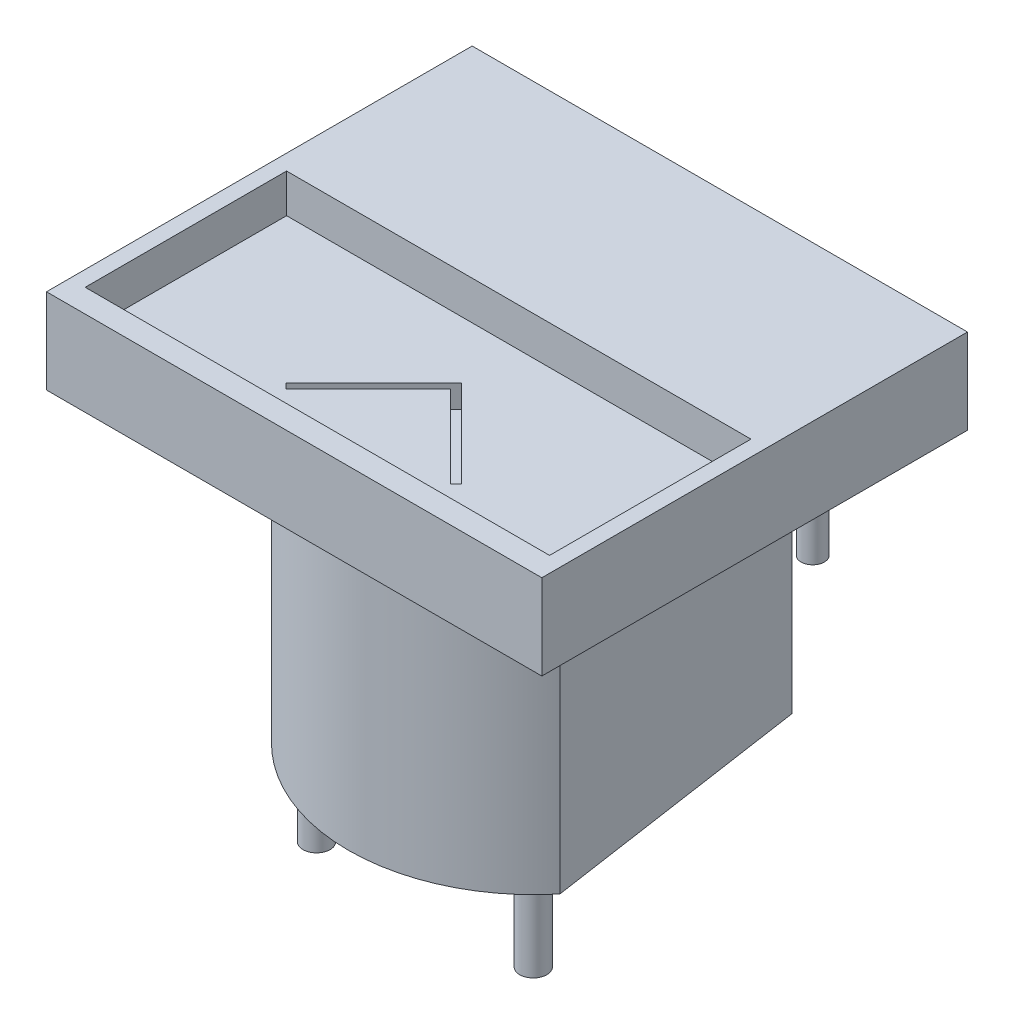
ISO-10303-21;
HEADER;
FILE_DESCRIPTION(('STEP AP214'),'2;1');
FILE_NAME('part.step','',(''),(''),'','','');
FILE_SCHEMA(('AUTOMOTIVE_DESIGN { 1 0 10303 214 1 1 1 1 }'));
ENDSEC;
DATA;
#1=APPLICATION_CONTEXT('core data for automotive mechanical design processes');
#2=APPLICATION_PROTOCOL_DEFINITION('international standard','automotive_design',2000,#1);
#3=PRODUCT_CONTEXT('',#1,'mechanical');
#4=PRODUCT('Part','Part','',(#3));
#5=PRODUCT_RELATED_PRODUCT_CATEGORY('part','',(#4));
#6=PRODUCT_DEFINITION_FORMATION('','',#4);
#7=PRODUCT_DEFINITION_CONTEXT('part definition',#1,'design');
#8=PRODUCT_DEFINITION('design','',#6,#7);
#9=PRODUCT_DEFINITION_SHAPE('','',#8);
#10=(LENGTH_UNIT() NAMED_UNIT(*) SI_UNIT(.MILLI.,.METRE.));
#11=(NAMED_UNIT(*) PLANE_ANGLE_UNIT() SI_UNIT($,.RADIAN.));
#12=(NAMED_UNIT(*) SI_UNIT($,.STERADIAN.) SOLID_ANGLE_UNIT());
#13=UNCERTAINTY_MEASURE_WITH_UNIT(LENGTH_MEASURE(1.E-05),#10,'distance_accuracy_value','');
#14=(GEOMETRIC_REPRESENTATION_CONTEXT(3) GLOBAL_UNCERTAINTY_ASSIGNED_CONTEXT((#13)) GLOBAL_UNIT_ASSIGNED_CONTEXT((#10,
#11,#12)) REPRESENTATION_CONTEXT('',''));
#15=CARTESIAN_POINT('',(0.,0.,0.));
#16=DIRECTION('',(0.,0.,1.));
#17=DIRECTION('',(1.,0.,0.));
#18=AXIS2_PLACEMENT_3D('',#15,#16,#17);
#19=CARTESIAN_POINT('',(14.,-50.,10.6061754313753));
#20=DIRECTION('',(0.,-1.,0.));
#21=DIRECTION('',(0.,0.,-1.));
#22=AXIS2_PLACEMENT_3D('',#19,#20,#21);
#23=PLANE('',#22);
#24=CARTESIAN_POINT('',(14.,-50.,10.6061754313753));
#25=DIRECTION('',(0.,1.,0.));
#26=DIRECTION('',(0.,0.,1.));
#27=AXIS2_PLACEMENT_3D('',#24,#25,#26);
#28=CIRCLE('',#27,1.75);
#29=CARTESIAN_POINT('',(14.,-50.,12.3561754313753));
#30=VERTEX_POINT('',#29);
#31=EDGE_CURVE('E220',#30,#30,#28,.T.);
#32=ORIENTED_EDGE('',*,*,#31,.F.);
#33=EDGE_LOOP('',(#32));
#34=FACE_BOUND('',#33,.T.);
#35=ADVANCED_FACE('F37',(#34),#23,.T.);
#36=CARTESIAN_POINT('',(-14.,-50.,10.6061754313753));
#37=DIRECTION('',(0.,-1.,0.));
#38=DIRECTION('',(0.,0.,-1.));
#39=AXIS2_PLACEMENT_3D('',#36,#37,#38);
#40=PLANE('',#39);
#41=CARTESIAN_POINT('',(-14.,-50.,10.6061754313753));
#42=DIRECTION('',(0.,1.,0.));
#43=DIRECTION('',(0.,0.,1.));
#44=AXIS2_PLACEMENT_3D('',#41,#42,#43);
#45=CIRCLE('',#44,1.75);
#46=CARTESIAN_POINT('',(-14.,-50.,12.3561754313753));
#47=VERTEX_POINT('',#46);
#48=EDGE_CURVE('E184',#47,#47,#45,.T.);
#49=ORIENTED_EDGE('',*,*,#48,.F.);
#50=EDGE_LOOP('',(#49));
#51=FACE_BOUND('',#50,.T.);
#52=ADVANCED_FACE('F455',(#51),#40,.T.);
#53=CARTESIAN_POINT('',(14.,-50.,10.6061754313753));
#54=DIRECTION('',(0.,1.,0.));
#55=DIRECTION('',(0.,0.,1.));
#56=AXIS2_PLACEMENT_3D('',#53,#54,#55);
#57=CYLINDRICAL_SURFACE('',#56,1.75);
#58=CARTESIAN_POINT('',(14.,-39.,10.6061754313753));
#59=DIRECTION('',(0.,1.,0.));
#60=DIRECTION('',(0.,0.,1.));
#61=AXIS2_PLACEMENT_3D('',#58,#59,#60);
#62=CIRCLE('',#61,1.75);
#63=CARTESIAN_POINT('',(14.,-39.,12.3561754313753));
#64=VERTEX_POINT('',#63);
#65=EDGE_CURVE('E215',#64,#64,#62,.T.);
#66=ORIENTED_EDGE('',*,*,#65,.F.);
#67=EDGE_LOOP('',(#66));
#68=FACE_BOUND('',#67,.T.);
#69=ORIENTED_EDGE('',*,*,#31,.T.);
#70=EDGE_LOOP('',(#69));
#71=FACE_BOUND('',#70,.T.);
#72=ADVANCED_FACE('F446',(#68,#71),#57,.T.);
#73=CARTESIAN_POINT('',(-14.,-50.,10.6061754313753));
#74=DIRECTION('',(0.,1.,0.));
#75=DIRECTION('',(0.,0.,1.));
#76=AXIS2_PLACEMENT_3D('',#73,#74,#75);
#77=CYLINDRICAL_SURFACE('',#76,1.75);
#78=CARTESIAN_POINT('',(-14.,-39.,10.6061754313753));
#79=DIRECTION('',(0.,1.,0.));
#80=DIRECTION('',(0.,0.,1.));
#81=AXIS2_PLACEMENT_3D('',#78,#79,#80);
#82=CIRCLE('',#81,1.75);
#83=CARTESIAN_POINT('',(-14.,-39.,12.3561754313753));
#84=VERTEX_POINT('',#83);
#85=EDGE_CURVE('E212',#84,#84,#82,.T.);
#86=ORIENTED_EDGE('',*,*,#85,.F.);
#87=EDGE_LOOP('',(#86));
#88=FACE_BOUND('',#87,.T.);
#89=ORIENTED_EDGE('',*,*,#48,.T.);
#90=EDGE_LOOP('',(#89));
#91=FACE_BOUND('',#90,.T.);
#92=ADVANCED_FACE('F436',(#88,#91),#77,.T.);
#93=CARTESIAN_POINT('',(-10.6066017177982,3.,17.9198851379885));
#94=DIRECTION('',(-0.707106781186546,0.,0.707106781186549));
#95=DIRECTION('',(0.707106781186549,0.,0.707106781186546));
#96=AXIS2_PLACEMENT_3D('',#93,#94,#95);
#97=PLANE('',#96);
#98=DIRECTION('',(0.,1.,0.));
#99=VECTOR('',#98,1.);
#100=CARTESIAN_POINT('',(-10.6066017177982,3.,17.9198851379885));
#101=LINE('',#100,#99);
#102=CARTESIAN_POINT('',(-10.6066017177982,6.,17.9198851379885));
#103=VERTEX_POINT('',#102);
#104=CARTESIAN_POINT('',(-10.6066017177982,3.,17.9198851379885));
#105=VERTEX_POINT('',#104);
#106=EDGE_CURVE('E280',#103,#105,#101,.F.);
#107=ORIENTED_EDGE('',*,*,#106,.T.);
#108=DIRECTION('',(0.707106781186547,0.,0.707106781186547));
#109=VECTOR('',#108,1.);
#110=CARTESIAN_POINT('',(-11.3137084989848,3.,17.2127783568019));
#111=LINE('',#110,#109);
#112=CARTESIAN_POINT('',(-11.3137084989848,3.,17.2127783568019));
#113=VERTEX_POINT('',#112);
#114=EDGE_CURVE('E174',#113,#105,#111,.T.);
#115=ORIENTED_EDGE('',*,*,#114,.F.);
#116=DIRECTION('',(0.,1.,0.));
#117=VECTOR('',#116,1.);
#118=CARTESIAN_POINT('',(-11.3137084989848,3.,17.2127783568019));
#119=LINE('',#118,#117);
#120=CARTESIAN_POINT('',(-11.3137084989848,6.,17.2127783568019));
#121=VERTEX_POINT('',#120);
#122=EDGE_CURVE('E270',#113,#121,#119,.T.);
#123=ORIENTED_EDGE('',*,*,#122,.T.);
#124=DIRECTION('',(0.707106781186549,0.,0.707106781186546));
#125=VECTOR('',#124,1.);
#126=CARTESIAN_POINT('',(-10.6066017177982,6.,17.9198851379885));
#127=LINE('',#126,#125);
#128=EDGE_CURVE('E182',#103,#121,#127,.F.);
#129=ORIENTED_EDGE('',*,*,#128,.F.);
#130=EDGE_LOOP('',(#107,#115,#123,#129));
#131=FACE_BOUND('',#130,.T.);
#132=ADVANCED_FACE('F426',(#131),#97,.F.);
#133=CARTESIAN_POINT('',(10.6066017177982,3.,17.9198851379885));
#134=DIRECTION('',(0.707106781186544,0.,0.707106781186551));
#135=DIRECTION('',(0.707106781186551,0.,-0.707106781186544));
#136=AXIS2_PLACEMENT_3D('',#133,#134,#135);
#137=PLANE('',#136);
#138=DIRECTION('',(0.,1.,0.));
#139=VECTOR('',#138,1.);
#140=CARTESIAN_POINT('',(11.3137084989847,3.,17.212778356802));
#141=LINE('',#140,#139);
#142=CARTESIAN_POINT('',(11.3137084989847,6.,17.212778356802));
#143=VERTEX_POINT('',#142);
#144=CARTESIAN_POINT('',(11.3137084989847,3.,17.212778356802));
#145=VERTEX_POINT('',#144);
#146=EDGE_CURVE('E268',#143,#145,#141,.F.);
#147=ORIENTED_EDGE('',*,*,#146,.T.);
#148=DIRECTION('',(0.707106781186551,0.,-0.707106781186544));
#149=VECTOR('',#148,1.);
#150=CARTESIAN_POINT('',(10.6066017177982,3.,17.9198851379885));
#151=LINE('',#150,#149);
#152=CARTESIAN_POINT('',(10.6066017177982,3.,17.9198851379885));
#153=VERTEX_POINT('',#152);
#154=EDGE_CURVE('E177',#153,#145,#151,.T.);
#155=ORIENTED_EDGE('',*,*,#154,.F.);
#156=DIRECTION('',(0.,1.,0.));
#157=VECTOR('',#156,1.);
#158=CARTESIAN_POINT('',(10.6066017177982,3.,17.9198851379885));
#159=LINE('',#158,#157);
#160=CARTESIAN_POINT('',(10.6066017177982,6.,17.9198851379885));
#161=VERTEX_POINT('',#160);
#162=EDGE_CURVE('E282',#153,#161,#159,.T.);
#163=ORIENTED_EDGE('',*,*,#162,.T.);
#164=DIRECTION('',(0.707106781186551,0.,-0.707106781186544));
#165=VECTOR('',#164,1.);
#166=CARTESIAN_POINT('',(10.6066017177982,6.,17.9198851379885));
#167=LINE('',#166,#165);
#168=EDGE_CURVE('E180',#143,#161,#167,.F.);
#169=ORIENTED_EDGE('',*,*,#168,.F.);
#170=EDGE_LOOP('',(#147,#155,#163,#169));
#171=FACE_BOUND('',#170,.T.);
#172=ADVANCED_FACE('F416',(#171),#137,.F.);
#173=CARTESIAN_POINT('',(0.,3.,0.));
#174=DIRECTION('',(0.,1.,0.));
#175=DIRECTION('',(0.,0.,1.));
#176=AXIS2_PLACEMENT_3D('',#173,#174,#175);
#177=PLANE('',#176);
#178=DIRECTION('',(0.707106781186549,0.,-0.707106781186546));
#179=VECTOR('',#178,1.);
#180=CARTESIAN_POINT('',(0.,3.,7.31328342019028));
#181=LINE('',#180,#179);
#182=CARTESIAN_POINT('',(0.,3.,7.31328342019028));
#183=VERTEX_POINT('',#182);
#184=EDGE_CURVE('E278',#105,#183,#181,.T.);
#185=ORIENTED_EDGE('',*,*,#184,.T.);
#186=DIRECTION('',(0.707106781186544,0.,0.707106781186551));
#187=VECTOR('',#186,1.);
#188=CARTESIAN_POINT('',(10.6066017177982,3.,17.9198851379885));
#189=LINE('',#188,#187);
#190=EDGE_CURVE('E160',#183,#153,#189,.T.);
#191=ORIENTED_EDGE('',*,*,#190,.T.);
#192=ORIENTED_EDGE('',*,*,#154,.T.);
#193=DIRECTION('',(-0.707106781186544,0.,-0.707106781186551));
#194=VECTOR('',#193,1.);
#195=CARTESIAN_POINT('',(11.3137084989847,3.,17.212778356802));
#196=LINE('',#195,#194);
#197=CARTESIAN_POINT('',(0.,3.,5.89906985781718));
#198=VERTEX_POINT('',#197);
#199=EDGE_CURVE('E266',#145,#198,#196,.T.);
#200=ORIENTED_EDGE('',*,*,#199,.T.);
#201=DIRECTION('',(-0.707106781186548,0.,0.707106781186547));
#202=VECTOR('',#201,1.);
#203=CARTESIAN_POINT('',(0.,3.,5.89906985781718));
#204=LINE('',#203,#202);
#205=EDGE_CURVE('E273',#198,#113,#204,.T.);
#206=ORIENTED_EDGE('',*,*,#205,.T.);
#207=ORIENTED_EDGE('',*,*,#114,.T.);
#208=EDGE_LOOP('',(#185,#191,#192,#200,#206,#207));
#209=FACE_BOUND('',#208,.T.);
#210=ADVANCED_FACE('F406',(#209),#177,.T.);
#211=CARTESIAN_POINT('',(0.,-1.,-3.5));
#212=DIRECTION('',(0.,-1.,0.));
#213=DIRECTION('',(0.,0.,-1.));
#214=AXIS2_PLACEMENT_3D('',#211,#212,#213);
#215=PLANE('',#214);
#216=DIRECTION('',(0.145801924978711,0.,0.989313801921565));
#217=VECTOR('',#216,1.);
#218=CARTESIAN_POINT('',(18.5541099254204,-0.999999999999987,11.7231732853376));
#219=LINE('',#218,#217);
#220=CARTESIAN_POINT('',(18.5541099254204,-0.999999999999994,11.7231732853376));
#221=VERTEX_POINT('',#220);
#222=CARTESIAN_POINT('',(13.3735574642895,-0.999999999999994,-23.4285714678536));
#223=VERTEX_POINT('',#222);
#224=EDGE_CURVE('E171',#221,#223,#219,.F.);
#225=ORIENTED_EDGE('',*,*,#224,.T.);
#226=CARTESIAN_POINT('',(0.,-1.,-3.5));
#227=DIRECTION('',(0.,1.,0.));
#228=DIRECTION('',(0.,0.,1.));
#229=AXIS2_PLACEMENT_3D('',#226,#227,#228);
#230=CIRCLE('',#229,24.);
#231=EDGE_CURVE('E165',#221,#223,#230,.T.);
#232=ORIENTED_EDGE('',*,*,#231,.F.);
#233=EDGE_LOOP('',(#225,#232));
#234=FACE_BOUND('',#233,.T.);
#235=ADVANCED_FACE('F303',(#234),#215,.T.);
#236=CARTESIAN_POINT('',(18.5541099254204,-39.,11.7231732853376));
#237=DIRECTION('',(-0.989313801921565,0.,0.145801924978711));
#238=DIRECTION('',(0.145801924978711,0.,0.989313801921565));
#239=AXIS2_PLACEMENT_3D('',#236,#237,#238);
#240=PLANE('',#239);
#241=DIRECTION('',(0.,1.,0.));
#242=VECTOR('',#241,1.);
#243=CARTESIAN_POINT('',(18.5541099254204,-1.,11.7231732853376));
#244=LINE('',#243,#242);
#245=CARTESIAN_POINT('',(18.5541099254204,-39.,11.7231732853376));
#246=VERTEX_POINT('',#245);
#247=EDGE_CURVE('E159',#246,#221,#244,.T.);
#248=ORIENTED_EDGE('',*,*,#247,.F.);
#249=DIRECTION('',(0.145801924978711,0.,0.989313801921565));
#250=VECTOR('',#249,1.);
#251=CARTESIAN_POINT('',(13.3735574642895,-39.,-23.4285714678536));
#252=LINE('',#251,#250);
#253=CARTESIAN_POINT('',(13.3735574642895,-39.,-23.4285714678536));
#254=VERTEX_POINT('',#253);
#255=EDGE_CURVE('E146',#254,#246,#252,.T.);
#256=ORIENTED_EDGE('',*,*,#255,.F.);
#257=DIRECTION('',(0.,1.,0.));
#258=VECTOR('',#257,1.);
#259=CARTESIAN_POINT('',(13.3735574642895,-1.,-23.4285714678536));
#260=LINE('',#259,#258);
#261=EDGE_CURVE('E153',#223,#254,#260,.F.);
#262=ORIENTED_EDGE('',*,*,#261,.F.);
#263=ORIENTED_EDGE('',*,*,#224,.F.);
#264=EDGE_LOOP('',(#248,#256,#262,#263));
#265=FACE_BOUND('',#264,.T.);
#266=ADVANCED_FACE('F157',(#265),#240,.F.);
#267=CARTESIAN_POINT('',(0.,-1.,-3.5));
#268=DIRECTION('',(0.,-1.,0.));
#269=DIRECTION('',(0.,0.,-1.));
#270=AXIS2_PLACEMENT_3D('',#267,#268,#269);
#271=PLANE('',#270);
#272=DIRECTION('',(0.145801924978711,0.,-0.989313801921565));
#273=VECTOR('',#272,1.);
#274=CARTESIAN_POINT('',(-18.5541099254204,-0.999999999999987,11.7231732853376));
#275=LINE('',#274,#273);
#276=CARTESIAN_POINT('',(-13.3735574642895,-0.999999999999994,-23.4285714678536));
#277=VERTEX_POINT('',#276);
#278=CARTESIAN_POINT('',(-18.5541099254204,-0.999999999999994,11.7231732853376));
#279=VERTEX_POINT('',#278);
#280=EDGE_CURVE('E173',#277,#279,#275,.F.);
#281=ORIENTED_EDGE('',*,*,#280,.T.);
#282=CARTESIAN_POINT('',(0.,-1.,-3.5));
#283=DIRECTION('',(0.,1.,0.));
#284=DIRECTION('',(0.,0.,1.));
#285=AXIS2_PLACEMENT_3D('',#282,#283,#284);
#286=CIRCLE('',#285,24.);
#287=EDGE_CURVE('E209',#277,#279,#286,.T.);
#288=ORIENTED_EDGE('',*,*,#287,.F.);
#289=EDGE_LOOP('',(#281,#288));
#290=FACE_BOUND('',#289,.T.);
#291=ADVANCED_FACE('F294',(#290),#271,.T.);
#292=CARTESIAN_POINT('',(-18.5541099254204,-39.,11.7231732853376));
#293=DIRECTION('',(0.989313801921565,0.,0.145801924978711));
#294=DIRECTION('',(0.145801924978711,0.,-0.989313801921565));
#295=AXIS2_PLACEMENT_3D('',#292,#293,#294);
#296=PLANE('',#295);
#297=DIRECTION('',(0.,1.,0.));
#298=VECTOR('',#297,1.);
#299=CARTESIAN_POINT('',(-13.3735574642895,-1.,-23.4285714678536));
#300=LINE('',#299,#298);
#301=CARTESIAN_POINT('',(-13.3735574642895,-39.,-23.4285714678536));
#302=VERTEX_POINT('',#301);
#303=EDGE_CURVE('E152',#302,#277,#300,.T.);
#304=ORIENTED_EDGE('',*,*,#303,.F.);
#305=DIRECTION('',(0.145801924978711,0.,-0.989313801921565));
#306=VECTOR('',#305,1.);
#307=CARTESIAN_POINT('',(-18.5541099254204,-39.,11.7231732853376));
#308=LINE('',#307,#306);
#309=CARTESIAN_POINT('',(-18.5541099254204,-39.,11.7231732853376));
#310=VERTEX_POINT('',#309);
#311=EDGE_CURVE('E148',#310,#302,#308,.T.);
#312=ORIENTED_EDGE('',*,*,#311,.F.);
#313=DIRECTION('',(0.,1.,0.));
#314=VECTOR('',#313,1.);
#315=CARTESIAN_POINT('',(-18.5541099254204,-1.,11.7231732853376));
#316=LINE('',#315,#314);
#317=EDGE_CURVE('E208',#279,#310,#316,.F.);
#318=ORIENTED_EDGE('',*,*,#317,.F.);
#319=ORIENTED_EDGE('',*,*,#280,.F.);
#320=EDGE_LOOP('',(#304,#312,#318,#319));
#321=FACE_BOUND('',#320,.T.);
#322=ADVANCED_FACE('F291',(#321),#296,.F.);
#323=CARTESIAN_POINT('',(0.,-39.,-3.5));
#324=DIRECTION('',(0.,-1.,0.));
#325=DIRECTION('',(0.,0.,-1.));
#326=AXIS2_PLACEMENT_3D('',#323,#324,#325);
#327=PLANE('',#326);
#328=CARTESIAN_POINT('',(0.,-39.,-3.5));
#329=DIRECTION('',(0.,1.,0.));
#330=DIRECTION('',(0.,0.,1.));
#331=AXIS2_PLACEMENT_3D('',#328,#329,#330);
#332=CIRCLE('',#331,24.);
#333=EDGE_CURVE('E142',#254,#302,#332,.T.);
#334=ORIENTED_EDGE('',*,*,#333,.F.);
#335=ORIENTED_EDGE('',*,*,#255,.T.);
#336=CARTESIAN_POINT('',(0.,-39.,-3.5));
#337=DIRECTION('',(0.,1.,0.));
#338=DIRECTION('',(0.,0.,1.));
#339=AXIS2_PLACEMENT_3D('',#336,#337,#338);
#340=CIRCLE('',#339,24.);
#341=EDGE_CURVE('E137',#310,#246,#340,.T.);
#342=ORIENTED_EDGE('',*,*,#341,.F.);
#343=ORIENTED_EDGE('',*,*,#311,.T.);
#344=EDGE_LOOP('',(#334,#335,#342,#343));
#345=FACE_BOUND('',#344,.T.);
#346=ORIENTED_EDGE('',*,*,#85,.T.);
#347=EDGE_LOOP('',(#346));
#348=FACE_BOUND('',#347,.T.);
#349=ORIENTED_EDGE('',*,*,#65,.T.);
#350=EDGE_LOOP('',(#349));
#351=FACE_BOUND('',#350,.T.);
#352=ADVANCED_FACE('F144',(#345,#348,#351),#327,.T.);
#353=CARTESIAN_POINT('',(10.6066017177982,3.,17.9198851379885));
#354=DIRECTION('',(-0.707106781186551,0.,0.707106781186544));
#355=DIRECTION('',(0.707106781186544,0.,0.707106781186551));
#356=AXIS2_PLACEMENT_3D('',#353,#354,#355);
#357=PLANE('',#356);
#358=ORIENTED_EDGE('',*,*,#162,.F.);
#359=ORIENTED_EDGE('',*,*,#190,.F.);
#360=DIRECTION('',(0.,1.,0.));
#361=VECTOR('',#360,1.);
#362=CARTESIAN_POINT('',(0.,3.,7.31328342019028));
#363=LINE('',#362,#361);
#364=CARTESIAN_POINT('',(0.,6.,7.31328342019028));
#365=VERTEX_POINT('',#364);
#366=EDGE_CURVE('E276',#183,#365,#363,.T.);
#367=ORIENTED_EDGE('',*,*,#366,.T.);
#368=DIRECTION('',(-0.707106781186544,0.,-0.707106781186551));
#369=VECTOR('',#368,1.);
#370=CARTESIAN_POINT('',(10.6066017177982,6.,17.9198851379885));
#371=LINE('',#370,#369);
#372=EDGE_CURVE('E207',#161,#365,#371,.T.);
#373=ORIENTED_EDGE('',*,*,#372,.F.);
#374=EDGE_LOOP('',(#358,#359,#367,#373));
#375=FACE_BOUND('',#374,.T.);
#376=ADVANCED_FACE('F372',(#375),#357,.F.);
#377=CARTESIAN_POINT('',(0.,3.,7.31328342019028));
#378=DIRECTION('',(0.707106781186546,0.,0.707106781186549));
#379=DIRECTION('',(0.707106781186549,0.,-0.707106781186546));
#380=AXIS2_PLACEMENT_3D('',#377,#378,#379);
#381=PLANE('',#380);
#382=ORIENTED_EDGE('',*,*,#366,.F.);
#383=ORIENTED_EDGE('',*,*,#184,.F.);
#384=ORIENTED_EDGE('',*,*,#106,.F.);
#385=DIRECTION('',(-0.707106781186548,0.,0.707106781186547));
#386=VECTOR('',#385,1.);
#387=CARTESIAN_POINT('',(0.,6.,7.31328342019028));
#388=LINE('',#387,#386);
#389=EDGE_CURVE('E259',#365,#103,#388,.T.);
#390=ORIENTED_EDGE('',*,*,#389,.F.);
#391=EDGE_LOOP('',(#382,#383,#384,#390));
#392=FACE_BOUND('',#391,.T.);
#393=ADVANCED_FACE('F368',(#392),#381,.F.);
#394=CARTESIAN_POINT('',(0.,3.,5.89906985781718));
#395=DIRECTION('',(-0.707106781186547,0.,-0.707106781186548));
#396=DIRECTION('',(-0.707106781186548,0.,0.707106781186547));
#397=AXIS2_PLACEMENT_3D('',#394,#395,#396);
#398=PLANE('',#397);
#399=ORIENTED_EDGE('',*,*,#122,.F.);
#400=ORIENTED_EDGE('',*,*,#205,.F.);
#401=DIRECTION('',(0.,1.,0.));
#402=VECTOR('',#401,1.);
#403=CARTESIAN_POINT('',(0.,3.,5.89906985781718));
#404=LINE('',#403,#402);
#405=CARTESIAN_POINT('',(0.,6.,5.89906985781718));
#406=VERTEX_POINT('',#405);
#407=EDGE_CURVE('E264',#198,#406,#404,.T.);
#408=ORIENTED_EDGE('',*,*,#407,.T.);
#409=DIRECTION('',(0.707106781186548,0.,-0.707106781186547));
#410=VECTOR('',#409,1.);
#411=CARTESIAN_POINT('',(-11.3137084989848,6.,17.2127783568019));
#412=LINE('',#411,#410);
#413=EDGE_CURVE('E256',#121,#406,#412,.T.);
#414=ORIENTED_EDGE('',*,*,#413,.F.);
#415=EDGE_LOOP('',(#399,#400,#408,#414));
#416=FACE_BOUND('',#415,.T.);
#417=ADVANCED_FACE('F364',(#416),#398,.F.);
#418=CARTESIAN_POINT('',(11.3137084989847,3.,17.212778356802));
#419=DIRECTION('',(0.707106781186551,0.,-0.707106781186544));
#420=DIRECTION('',(-0.707106781186544,0.,-0.707106781186551));
#421=AXIS2_PLACEMENT_3D('',#418,#419,#420);
#422=PLANE('',#421);
#423=ORIENTED_EDGE('',*,*,#407,.F.);
#424=ORIENTED_EDGE('',*,*,#199,.F.);
#425=ORIENTED_EDGE('',*,*,#146,.F.);
#426=DIRECTION('',(0.707106781186544,0.,0.707106781186551));
#427=VECTOR('',#426,1.);
#428=CARTESIAN_POINT('',(0.,6.,5.89906985781718));
#429=LINE('',#428,#427);
#430=EDGE_CURVE('E205',#406,#143,#429,.T.);
#431=ORIENTED_EDGE('',*,*,#430,.F.);
#432=EDGE_LOOP('',(#423,#424,#425,#431));
#433=FACE_BOUND('',#432,.T.);
#434=ADVANCED_FACE('F361',(#433),#422,.F.);
#435=CARTESIAN_POINT('',(0.,-1.,-3.5));
#436=DIRECTION('',(0.,1.,0.));
#437=DIRECTION('',(0.,0.,1.));
#438=AXIS2_PLACEMENT_3D('',#435,#436,#437);
#439=CYLINDRICAL_SURFACE('',#438,24.);
#440=ORIENTED_EDGE('',*,*,#261,.T.);
#441=ORIENTED_EDGE('',*,*,#333,.T.);
#442=ORIENTED_EDGE('',*,*,#303,.T.);
#443=ORIENTED_EDGE('',*,*,#287,.T.);
#444=ORIENTED_EDGE('',*,*,#317,.T.);
#445=ORIENTED_EDGE('',*,*,#341,.T.);
#446=ORIENTED_EDGE('',*,*,#247,.T.);
#447=ORIENTED_EDGE('',*,*,#231,.T.);
#448=EDGE_LOOP('',(#440,#441,#442,#443,#444,#445,#446,#447));
#449=FACE_BOUND('',#448,.T.);
#450=CARTESIAN_POINT('',(0.,0.,-3.5));
#451=DIRECTION('',(0.,1.,0.));
#452=DIRECTION('',(0.,0.,1.));
#453=AXIS2_PLACEMENT_3D('',#450,#451,#452);
#454=CIRCLE('',#453,24.);
#455=CARTESIAN_POINT('',(0.,0.,20.5));
#456=VERTEX_POINT('',#455);
#457=EDGE_CURVE('E201',#456,#456,#454,.F.);
#458=ORIENTED_EDGE('',*,*,#457,.T.);
#459=EDGE_LOOP('',(#458));
#460=FACE_BOUND('',#459,.T.);
#461=ADVANCED_FACE('F162',(#449,#460),#439,.T.);
#462=CARTESIAN_POINT('',(0.,6.,0.));
#463=DIRECTION('',(0.,1.,0.));
#464=DIRECTION('',(0.,0.,1.));
#465=AXIS2_PLACEMENT_3D('',#462,#463,#464);
#466=PLANE('',#465);
#467=DIRECTION('',(0.,0.,1.));
#468=VECTOR('',#467,1.);
#469=CARTESIAN_POINT('',(-30.,6.,24.5));
#470=LINE('',#469,#468);
#471=CARTESIAN_POINT('',(-30.,6.,-1.52053803732598));
#472=VERTEX_POINT('',#471);
#473=CARTESIAN_POINT('',(-30.,6.,24.5));
#474=VERTEX_POINT('',#473);
#475=EDGE_CURVE('E532',#472,#474,#470,.T.);
#476=ORIENTED_EDGE('',*,*,#475,.T.);
#477=DIRECTION('',(1.,0.,0.));
#478=VECTOR('',#477,1.);
#479=CARTESIAN_POINT('',(30.,6.,24.5));
#480=LINE('',#479,#478);
#481=CARTESIAN_POINT('',(30.,6.,24.5));
#482=VERTEX_POINT('',#481);
#483=EDGE_CURVE('E538',#474,#482,#480,.T.);
#484=ORIENTED_EDGE('',*,*,#483,.T.);
#485=DIRECTION('',(0.,0.,-1.));
#486=VECTOR('',#485,1.);
#487=CARTESIAN_POINT('',(30.,6.,24.5));
#488=LINE('',#487,#486);
#489=CARTESIAN_POINT('',(30.,6.,-1.52053803732598));
#490=VERTEX_POINT('',#489);
#491=EDGE_CURVE('E204',#482,#490,#488,.T.);
#492=ORIENTED_EDGE('',*,*,#491,.T.);
#493=DIRECTION('',(-1.,0.,0.));
#494=VECTOR('',#493,1.);
#495=CARTESIAN_POINT('',(30.,6.,-1.52053803732598));
#496=LINE('',#495,#494);
#497=EDGE_CURVE('E523',#490,#472,#496,.T.);
#498=ORIENTED_EDGE('',*,*,#497,.T.);
#499=EDGE_LOOP('',(#476,#484,#492,#498));
#500=FACE_BOUND('',#499,.T.);
#501=ORIENTED_EDGE('',*,*,#413,.T.);
#502=ORIENTED_EDGE('',*,*,#430,.T.);
#503=ORIENTED_EDGE('',*,*,#168,.T.);
#504=ORIENTED_EDGE('',*,*,#372,.T.);
#505=ORIENTED_EDGE('',*,*,#389,.T.);
#506=ORIENTED_EDGE('',*,*,#128,.T.);
#507=EDGE_LOOP('',(#501,#502,#503,#504,#505,#506));
#508=FACE_BOUND('',#507,.T.);
#509=ADVANCED_FACE('F354',(#500,#508),#466,.T.);
#510=CARTESIAN_POINT('',(0.,0.,0.));
#511=DIRECTION('',(0.,1.,0.));
#512=DIRECTION('',(0.,0.,1.));
#513=AXIS2_PLACEMENT_3D('',#510,#511,#512);
#514=PLANE('',#513);
#515=CARTESIAN_POINT('',(-25.9999999999999,0.,-13.5000000000002));
#516=DIRECTION('',(0.,1.,0.));
#517=DIRECTION('',(0.,0.,1.));
#518=AXIS2_PLACEMENT_3D('',#515,#516,#517);
#519=CIRCLE('',#518,1.5);
#520=CARTESIAN_POINT('',(-25.9999999999999,0.,-12.0000000000002));
#521=VERTEX_POINT('',#520);
#522=EDGE_CURVE('E11',#521,#521,#519,.F.);
#523=ORIENTED_EDGE('',*,*,#522,.F.);
#524=EDGE_LOOP('',(#523));
#525=FACE_BOUND('',#524,.T.);
#526=CARTESIAN_POINT('',(26.,0.,-13.5));
#527=DIRECTION('',(0.,1.,0.));
#528=DIRECTION('',(0.,0.,1.));
#529=AXIS2_PLACEMENT_3D('',#526,#527,#528);
#530=CIRCLE('',#529,1.5);
#531=CARTESIAN_POINT('',(26.,0.,-12.));
#532=VERTEX_POINT('',#531);
#533=EDGE_CURVE('E45',#532,#532,#530,.F.);
#534=ORIENTED_EDGE('',*,*,#533,.F.);
#535=EDGE_LOOP('',(#534));
#536=FACE_BOUND('',#535,.T.);
#537=ORIENTED_EDGE('',*,*,#457,.F.);
#538=EDGE_LOOP('',(#537));
#539=FACE_BOUND('',#538,.T.);
#540=DIRECTION('',(1.,0.,0.));
#541=VECTOR('',#540,1.);
#542=CARTESIAN_POINT('',(0.,0.,-27.5));
#543=LINE('',#542,#541);
#544=CARTESIAN_POINT('',(-32.,0.,-27.5));
#545=VERTEX_POINT('',#544);
#546=CARTESIAN_POINT('',(32.,0.,-27.5));
#547=VERTEX_POINT('',#546);
#548=EDGE_CURVE('E194',#545,#547,#543,.T.);
#549=ORIENTED_EDGE('',*,*,#548,.T.);
#550=DIRECTION('',(0.,0.,1.));
#551=VECTOR('',#550,1.);
#552=CARTESIAN_POINT('',(32.,0.,0.));
#553=LINE('',#552,#551);
#554=CARTESIAN_POINT('',(32.,0.,27.5));
#555=VERTEX_POINT('',#554);
#556=EDGE_CURVE('E198',#547,#555,#553,.T.);
#557=ORIENTED_EDGE('',*,*,#556,.T.);
#558=DIRECTION('',(1.,0.,0.));
#559=VECTOR('',#558,1.);
#560=CARTESIAN_POINT('',(0.,0.,27.5));
#561=LINE('',#560,#559);
#562=CARTESIAN_POINT('',(-32.,0.,27.5));
#563=VERTEX_POINT('',#562);
#564=EDGE_CURVE('E185',#555,#563,#561,.F.);
#565=ORIENTED_EDGE('',*,*,#564,.T.);
#566=DIRECTION('',(0.,0.,1.));
#567=VECTOR('',#566,1.);
#568=CARTESIAN_POINT('',(-32.,0.,0.));
#569=LINE('',#568,#567);
#570=EDGE_CURVE('E190',#563,#545,#569,.F.);
#571=ORIENTED_EDGE('',*,*,#570,.T.);
#572=EDGE_LOOP('',(#549,#557,#565,#571));
#573=FACE_BOUND('',#572,.T.);
#574=ADVANCED_FACE('F350',(#525,#536,#539,#573),#514,.F.);
#575=CARTESIAN_POINT('',(30.,6.,24.5));
#576=DIRECTION('',(1.,0.,0.));
#577=DIRECTION('',(0.,0.,-1.));
#578=AXIS2_PLACEMENT_3D('',#575,#576,#577);
#579=PLANE('',#578);
#580=DIRECTION('',(0.,1.,0.));
#581=VECTOR('',#580,1.);
#582=CARTESIAN_POINT('',(30.,6.,-1.52053803732598));
#583=LINE('',#582,#581);
#584=CARTESIAN_POINT('',(30.,11.,-1.52053803732598));
#585=VERTEX_POINT('',#584);
#586=EDGE_CURVE('E526',#585,#490,#583,.F.);
#587=ORIENTED_EDGE('',*,*,#586,.T.);
#588=ORIENTED_EDGE('',*,*,#491,.F.);
#589=DIRECTION('',(0.,1.,0.));
#590=VECTOR('',#589,1.);
#591=CARTESIAN_POINT('',(30.,6.,24.5));
#592=LINE('',#591,#590);
#593=CARTESIAN_POINT('',(30.,11.,24.5));
#594=VERTEX_POINT('',#593);
#595=EDGE_CURVE('E535',#482,#594,#592,.T.);
#596=ORIENTED_EDGE('',*,*,#595,.T.);
#597=DIRECTION('',(0.,0.,1.));
#598=VECTOR('',#597,1.);
#599=CARTESIAN_POINT('',(30.,11.,0.));
#600=LINE('',#599,#598);
#601=EDGE_CURVE('E188',#585,#594,#600,.T.);
#602=ORIENTED_EDGE('',*,*,#601,.F.);
#603=EDGE_LOOP('',(#587,#588,#596,#602));
#604=FACE_BOUND('',#603,.T.);
#605=ADVANCED_FACE('F346',(#604),#579,.F.);
#606=CARTESIAN_POINT('',(30.,6.,24.5));
#607=DIRECTION('',(0.,0.,1.));
#608=DIRECTION('',(1.,0.,0.));
#609=AXIS2_PLACEMENT_3D('',#606,#607,#608);
#610=PLANE('',#609);
#611=ORIENTED_EDGE('',*,*,#595,.F.);
#612=ORIENTED_EDGE('',*,*,#483,.F.);
#613=DIRECTION('',(0.,1.,0.));
#614=VECTOR('',#613,1.);
#615=CARTESIAN_POINT('',(-30.,6.,24.5));
#616=LINE('',#615,#614);
#617=CARTESIAN_POINT('',(-30.,11.,24.5));
#618=VERTEX_POINT('',#617);
#619=EDGE_CURVE('E529',#474,#618,#616,.T.);
#620=ORIENTED_EDGE('',*,*,#619,.T.);
#621=DIRECTION('',(1.,0.,0.));
#622=VECTOR('',#621,1.);
#623=CARTESIAN_POINT('',(0.,11.,24.5));
#624=LINE('',#623,#622);
#625=EDGE_CURVE('E516',#594,#618,#624,.F.);
#626=ORIENTED_EDGE('',*,*,#625,.F.);
#627=EDGE_LOOP('',(#611,#612,#620,#626));
#628=FACE_BOUND('',#627,.T.);
#629=ADVANCED_FACE('F342',(#628),#610,.F.);
#630=CARTESIAN_POINT('',(-30.,6.,24.5));
#631=DIRECTION('',(-1.,0.,0.));
#632=DIRECTION('',(0.,0.,1.));
#633=AXIS2_PLACEMENT_3D('',#630,#631,#632);
#634=PLANE('',#633);
#635=ORIENTED_EDGE('',*,*,#619,.F.);
#636=ORIENTED_EDGE('',*,*,#475,.F.);
#637=DIRECTION('',(0.,1.,0.));
#638=VECTOR('',#637,1.);
#639=CARTESIAN_POINT('',(-30.,6.,-1.52053803732598));
#640=LINE('',#639,#638);
#641=CARTESIAN_POINT('',(-30.,11.,-1.52053803732598));
#642=VERTEX_POINT('',#641);
#643=EDGE_CURVE('E200',#472,#642,#640,.T.);
#644=ORIENTED_EDGE('',*,*,#643,.T.);
#645=DIRECTION('',(0.,0.,1.));
#646=VECTOR('',#645,1.);
#647=CARTESIAN_POINT('',(-30.,11.,0.));
#648=LINE('',#647,#646);
#649=EDGE_CURVE('E513',#618,#642,#648,.F.);
#650=ORIENTED_EDGE('',*,*,#649,.F.);
#651=EDGE_LOOP('',(#635,#636,#644,#650));
#652=FACE_BOUND('',#651,.T.);
#653=ADVANCED_FACE('F338',(#652),#634,.F.);
#654=CARTESIAN_POINT('',(30.,6.,-1.52053803732598));
#655=DIRECTION('',(0.,0.,-1.));
#656=DIRECTION('',(-1.,0.,0.));
#657=AXIS2_PLACEMENT_3D('',#654,#655,#656);
#658=PLANE('',#657);
#659=ORIENTED_EDGE('',*,*,#643,.F.);
#660=ORIENTED_EDGE('',*,*,#497,.F.);
#661=ORIENTED_EDGE('',*,*,#586,.F.);
#662=DIRECTION('',(1.,0.,0.));
#663=VECTOR('',#662,1.);
#664=CARTESIAN_POINT('',(0.,11.,-1.52053803732598));
#665=LINE('',#664,#663);
#666=EDGE_CURVE('E510',#642,#585,#665,.T.);
#667=ORIENTED_EDGE('',*,*,#666,.F.);
#668=EDGE_LOOP('',(#659,#660,#661,#667));
#669=FACE_BOUND('',#668,.T.);
#670=ADVANCED_FACE('F334',(#669),#658,.F.);
#671=CARTESIAN_POINT('',(32.,11.,-27.5));
#672=DIRECTION('',(-1.,0.,0.));
#673=DIRECTION('',(0.,0.,1.));
#674=AXIS2_PLACEMENT_3D('',#671,#672,#673);
#675=PLANE('',#674);
#676=DIRECTION('',(0.,1.,0.));
#677=VECTOR('',#676,1.);
#678=CARTESIAN_POINT('',(32.,11.,-27.5));
#679=LINE('',#678,#677);
#680=CARTESIAN_POINT('',(32.,11.,-27.5));
#681=VERTEX_POINT('',#680);
#682=EDGE_CURVE('E197',#547,#681,#679,.T.);
#683=ORIENTED_EDGE('',*,*,#682,.T.);
#684=DIRECTION('',(0.,0.,1.));
#685=VECTOR('',#684,1.);
#686=CARTESIAN_POINT('',(32.,11.,0.));
#687=LINE('',#686,#685);
#688=CARTESIAN_POINT('',(32.,11.,27.5));
#689=VERTEX_POINT('',#688);
#690=EDGE_CURVE('E248',#689,#681,#687,.F.);
#691=ORIENTED_EDGE('',*,*,#690,.F.);
#692=DIRECTION('',(0.,1.,0.));
#693=VECTOR('',#692,1.);
#694=CARTESIAN_POINT('',(32.,11.,27.5));
#695=LINE('',#694,#693);
#696=EDGE_CURVE('E189',#689,#555,#695,.F.);
#697=ORIENTED_EDGE('',*,*,#696,.T.);
#698=ORIENTED_EDGE('',*,*,#556,.F.);
#699=EDGE_LOOP('',(#683,#691,#697,#698));
#700=FACE_BOUND('',#699,.T.);
#701=ADVANCED_FACE('F330',(#700),#675,.F.);
#702=CARTESIAN_POINT('',(-32.,11.,-27.5));
#703=DIRECTION('',(0.,0.,1.));
#704=DIRECTION('',(1.,0.,0.));
#705=AXIS2_PLACEMENT_3D('',#702,#703,#704);
#706=PLANE('',#705);
#707=ORIENTED_EDGE('',*,*,#548,.F.);
#708=DIRECTION('',(0.,1.,0.));
#709=VECTOR('',#708,1.);
#710=CARTESIAN_POINT('',(-32.,11.,-27.5));
#711=LINE('',#710,#709);
#712=CARTESIAN_POINT('',(-32.,11.,-27.5));
#713=VERTEX_POINT('',#712);
#714=EDGE_CURVE('E193',#545,#713,#711,.T.);
#715=ORIENTED_EDGE('',*,*,#714,.T.);
#716=DIRECTION('',(1.,0.,0.));
#717=VECTOR('',#716,1.);
#718=CARTESIAN_POINT('',(0.,11.,-27.5));
#719=LINE('',#718,#717);
#720=EDGE_CURVE('E233',#681,#713,#719,.F.);
#721=ORIENTED_EDGE('',*,*,#720,.F.);
#722=ORIENTED_EDGE('',*,*,#682,.F.);
#723=EDGE_LOOP('',(#707,#715,#721,#722));
#724=FACE_BOUND('',#723,.T.);
#725=ADVANCED_FACE('F327',(#724),#706,.F.);
#726=CARTESIAN_POINT('',(-32.,11.,-27.5));
#727=DIRECTION('',(1.,0.,0.));
#728=DIRECTION('',(0.,0.,-1.));
#729=AXIS2_PLACEMENT_3D('',#726,#727,#728);
#730=PLANE('',#729);
#731=DIRECTION('',(0.,1.,0.));
#732=VECTOR('',#731,1.);
#733=CARTESIAN_POINT('',(-32.,11.,27.5));
#734=LINE('',#733,#732);
#735=CARTESIAN_POINT('',(-32.,11.,27.5));
#736=VERTEX_POINT('',#735);
#737=EDGE_CURVE('E53',#563,#736,#734,.T.);
#738=ORIENTED_EDGE('',*,*,#737,.T.);
#739=DIRECTION('',(0.,0.,1.));
#740=VECTOR('',#739,1.);
#741=CARTESIAN_POINT('',(-32.,11.,0.));
#742=LINE('',#741,#740);
#743=EDGE_CURVE('E228',#713,#736,#742,.T.);
#744=ORIENTED_EDGE('',*,*,#743,.F.);
#745=ORIENTED_EDGE('',*,*,#714,.F.);
#746=ORIENTED_EDGE('',*,*,#570,.F.);
#747=EDGE_LOOP('',(#738,#744,#745,#746));
#748=FACE_BOUND('',#747,.T.);
#749=ADVANCED_FACE('F319',(#748),#730,.F.);
#750=CARTESIAN_POINT('',(-32.,11.,27.5));
#751=DIRECTION('',(0.,0.,-1.));
#752=DIRECTION('',(-1.,0.,0.));
#753=AXIS2_PLACEMENT_3D('',#750,#751,#752);
#754=PLANE('',#753);
#755=ORIENTED_EDGE('',*,*,#696,.F.);
#756=DIRECTION('',(1.,0.,0.));
#757=VECTOR('',#756,1.);
#758=CARTESIAN_POINT('',(0.,11.,27.5));
#759=LINE('',#758,#757);
#760=EDGE_CURVE('E224',#736,#689,#759,.T.);
#761=ORIENTED_EDGE('',*,*,#760,.F.);
#762=ORIENTED_EDGE('',*,*,#737,.F.);
#763=ORIENTED_EDGE('',*,*,#564,.F.);
#764=EDGE_LOOP('',(#755,#761,#762,#763));
#765=FACE_BOUND('',#764,.T.);
#766=ADVANCED_FACE('F308',(#765),#754,.F.);
#767=CARTESIAN_POINT('',(0.,11.,0.));
#768=DIRECTION('',(0.,1.,0.));
#769=DIRECTION('',(0.,0.,1.));
#770=AXIS2_PLACEMENT_3D('',#767,#768,#769);
#771=PLANE('',#770);
#772=ORIENTED_EDGE('',*,*,#743,.T.);
#773=ORIENTED_EDGE('',*,*,#760,.T.);
#774=ORIENTED_EDGE('',*,*,#690,.T.);
#775=ORIENTED_EDGE('',*,*,#720,.T.);
#776=EDGE_LOOP('',(#772,#773,#774,#775));
#777=FACE_BOUND('',#776,.T.);
#778=ORIENTED_EDGE('',*,*,#649,.T.);
#779=ORIENTED_EDGE('',*,*,#666,.T.);
#780=ORIENTED_EDGE('',*,*,#601,.T.);
#781=ORIENTED_EDGE('',*,*,#625,.T.);
#782=EDGE_LOOP('',(#778,#779,#780,#781));
#783=FACE_BOUND('',#782,.T.);
#784=ADVANCED_FACE('F305',(#777,#783),#771,.T.);
#785=CARTESIAN_POINT('',(26.,-10.,-13.5));
#786=DIRECTION('',(0.,1.,0.));
#787=DIRECTION('',(0.,0.,1.));
#788=AXIS2_PLACEMENT_3D('',#785,#786,#787);
#789=CYLINDRICAL_SURFACE('',#788,1.5);
#790=CARTESIAN_POINT('',(26.,-10.,-13.5));
#791=DIRECTION('',(0.,-1.,0.));
#792=DIRECTION('',(0.,0.,-1.));
#793=AXIS2_PLACEMENT_3D('',#790,#791,#792);
#794=CIRCLE('',#793,1.5);
#795=CARTESIAN_POINT('',(26.,-10.,-15.));
#796=VERTEX_POINT('',#795);
#797=EDGE_CURVE('E222',#796,#796,#794,.T.);
#798=ORIENTED_EDGE('',*,*,#797,.F.);
#799=EDGE_LOOP('',(#798));
#800=FACE_BOUND('',#799,.T.);
#801=ORIENTED_EDGE('',*,*,#533,.T.);
#802=EDGE_LOOP('',(#801));
#803=FACE_BOUND('',#802,.T.);
#804=ADVANCED_FACE('F307',(#800,#803),#789,.T.);
#805=CARTESIAN_POINT('',(26.,-10.,-13.5));
#806=DIRECTION('',(0.,-1.,0.));
#807=DIRECTION('',(0.,0.,-1.));
#808=AXIS2_PLACEMENT_3D('',#805,#806,#807);
#809=PLANE('',#808);
#810=ORIENTED_EDGE('',*,*,#797,.T.);
#811=EDGE_LOOP('',(#810));
#812=FACE_BOUND('',#811,.T.);
#813=ADVANCED_FACE('F316',(#812),#809,.T.);
#814=CARTESIAN_POINT('',(-25.9999999999999,-10.,-13.5000000000002));
#815=DIRECTION('',(0.,1.,0.));
#816=DIRECTION('',(0.,0.,1.));
#817=AXIS2_PLACEMENT_3D('',#814,#815,#816);
#818=CYLINDRICAL_SURFACE('',#817,1.5);
#819=CARTESIAN_POINT('',(-25.9999999999999,-10.,-13.5000000000002));
#820=DIRECTION('',(0.,-1.,0.));
#821=DIRECTION('',(0.,0.,1.));
#822=AXIS2_PLACEMENT_3D('',#819,#820,#821);
#823=CIRCLE('',#822,1.5);
#824=CARTESIAN_POINT('',(-25.9999999999999,-10.,-12.0000000000002));
#825=VERTEX_POINT('',#824);
#826=EDGE_CURVE('E505',#825,#825,#823,.T.);
#827=ORIENTED_EDGE('',*,*,#826,.F.);
#828=EDGE_LOOP('',(#827));
#829=FACE_BOUND('',#828,.T.);
#830=ORIENTED_EDGE('',*,*,#522,.T.);
#831=EDGE_LOOP('',(#830));
#832=FACE_BOUND('',#831,.T.);
#833=ADVANCED_FACE('F480',(#829,#832),#818,.T.);
#834=CARTESIAN_POINT('',(-25.9999999999999,-10.,-13.5000000000002));
#835=DIRECTION('',(0.,1.,0.));
#836=DIRECTION('',(0.,0.,1.));
#837=AXIS2_PLACEMENT_3D('',#834,#835,#836);
#838=PLANE('',#837);
#839=ORIENTED_EDGE('',*,*,#826,.T.);
#840=EDGE_LOOP('',(#839));
#841=FACE_BOUND('',#840,.T.);
#842=ADVANCED_FACE('F489',(#841),#838,.F.);
#843=CLOSED_SHELL('',(#35,#52,#72,#92,#132,#172,#210,#235,#266,#291,#322,#352,#376,#393,#417,
#434,#461,#509,#574,#605,#629,#653,#670,#701,#725,#749,#766,#784,#804,#813,#833,#842));
#844=MANIFOLD_SOLID_BREP('B2',#843);
#845=ADVANCED_BREP_SHAPE_REPRESENTATION('',(#18,#844),#14);
#846=SHAPE_DEFINITION_REPRESENTATION(#9,#845);
ENDSEC;
END-ISO-10303-21;
